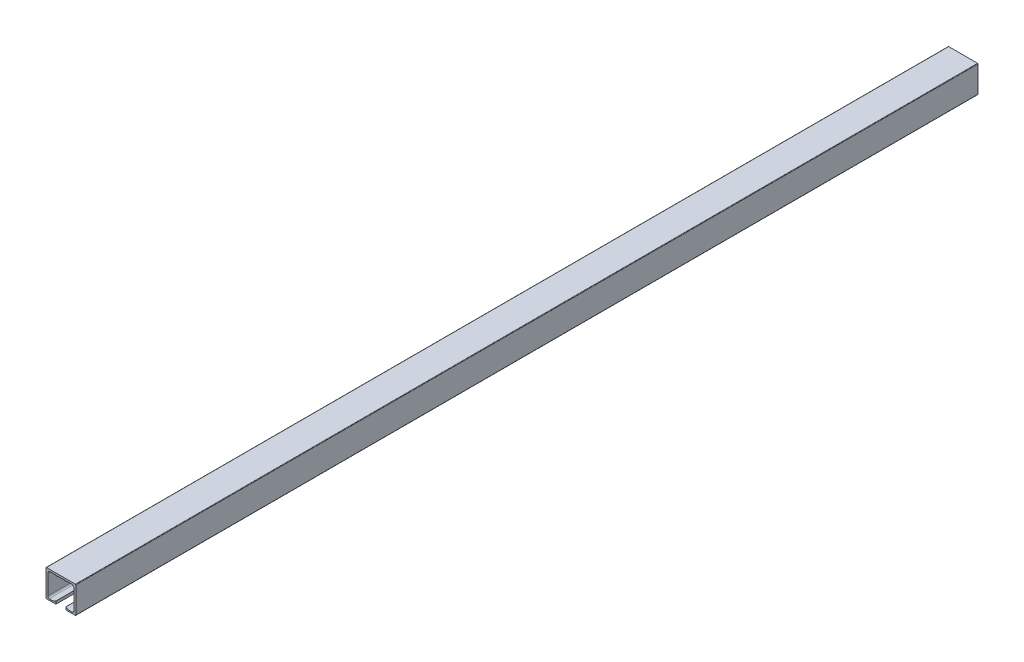
ISO-10303-21;
HEADER;
FILE_DESCRIPTION(('STEP AP214'),'2;1');
FILE_NAME('part.step','',(''),(''),'','','');
FILE_SCHEMA(('AUTOMOTIVE_DESIGN { 1 0 10303 214 1 1 1 1 }'));
ENDSEC;
DATA;
#1=APPLICATION_CONTEXT('core data for automotive mechanical design processes');
#2=APPLICATION_PROTOCOL_DEFINITION('international standard','automotive_design',2000,#1);
#3=PRODUCT_CONTEXT('',#1,'mechanical');
#4=PRODUCT('Part','Part','',(#3));
#5=PRODUCT_RELATED_PRODUCT_CATEGORY('part','',(#4));
#6=PRODUCT_DEFINITION_FORMATION('','',#4);
#7=PRODUCT_DEFINITION_CONTEXT('part definition',#1,'design');
#8=PRODUCT_DEFINITION('design','',#6,#7);
#9=PRODUCT_DEFINITION_SHAPE('','',#8);
#10=(LENGTH_UNIT() NAMED_UNIT(*) SI_UNIT(.MILLI.,.METRE.));
#11=(NAMED_UNIT(*) PLANE_ANGLE_UNIT() SI_UNIT($,.RADIAN.));
#12=(NAMED_UNIT(*) SI_UNIT($,.STERADIAN.) SOLID_ANGLE_UNIT());
#13=UNCERTAINTY_MEASURE_WITH_UNIT(LENGTH_MEASURE(1.E-05),#10,'distance_accuracy_value','');
#14=(GEOMETRIC_REPRESENTATION_CONTEXT(3) GLOBAL_UNCERTAINTY_ASSIGNED_CONTEXT((#13)) GLOBAL_UNIT_ASSIGNED_CONTEXT((#10,
#11,#12)) REPRESENTATION_CONTEXT('',''));
#15=CARTESIAN_POINT('',(0.,0.,0.));
#16=DIRECTION('',(0.,0.,1.));
#17=DIRECTION('',(1.,0.,0.));
#18=AXIS2_PLACEMENT_3D('',#15,#16,#17);
#19=CARTESIAN_POINT('',(10.5,-30.,1000.));
#20=DIRECTION('',(-1.,0.,0.));
#21=DIRECTION('',(0.,0.,1.));
#22=AXIS2_PLACEMENT_3D('',#19,#20,#21);
#23=PLANE('',#22);
#24=DIRECTION('',(0.,1.,0.));
#25=VECTOR('',#24,1.);
#26=CARTESIAN_POINT('',(10.5,-30.,0.));
#27=LINE('',#26,#25);
#28=CARTESIAN_POINT('',(10.5,-30.,0.));
#29=VERTEX_POINT('',#28);
#30=CARTESIAN_POINT('',(10.5,-27.,0.));
#31=VERTEX_POINT('',#30);
#32=EDGE_CURVE('E251',#29,#31,#27,.T.);
#33=ORIENTED_EDGE('',*,*,#32,.T.);
#34=DIRECTION('',(0.,0.,-1.));
#35=VECTOR('',#34,1.);
#36=CARTESIAN_POINT('',(10.5,-27.,1000.));
#37=LINE('',#36,#35);
#38=CARTESIAN_POINT('',(10.5,-27.,1000.));
#39=VERTEX_POINT('',#38);
#40=EDGE_CURVE('E11',#39,#31,#37,.T.);
#41=ORIENTED_EDGE('',*,*,#40,.F.);
#42=DIRECTION('',(0.,1.,0.));
#43=VECTOR('',#42,1.);
#44=CARTESIAN_POINT('',(10.5,-30.,1000.));
#45=LINE('',#44,#43);
#46=CARTESIAN_POINT('',(10.5,-30.,1000.));
#47=VERTEX_POINT('',#46);
#48=EDGE_CURVE('E305',#47,#39,#45,.T.);
#49=ORIENTED_EDGE('',*,*,#48,.F.);
#50=DIRECTION('',(0.,0.,-1.));
#51=VECTOR('',#50,1.);
#52=CARTESIAN_POINT('',(10.5,-30.,1000.));
#53=LINE('',#52,#51);
#54=EDGE_CURVE('E247',#47,#29,#53,.T.);
#55=ORIENTED_EDGE('',*,*,#54,.T.);
#56=EDGE_LOOP('',(#33,#41,#49,#55));
#57=FACE_BOUND('',#56,.T.);
#58=ADVANCED_FACE('F35',(#57),#23,.F.);
#59=CARTESIAN_POINT('',(4.94749132880816,-18.027421959274,1000.));
#60=DIRECTION('',(0.,0.,-1.));
#61=DIRECTION('',(-1.,0.,0.));
#62=AXIS2_PLACEMENT_3D('',#59,#60,#61);
#63=CYLINDRICAL_SURFACE('',#62,10.551659075263);
#64=CARTESIAN_POINT('',(4.94749132880816,-18.027421959274,0.));
#65=DIRECTION('',(0.,0.,-1.));
#66=DIRECTION('',(1.,0.,0.));
#67=AXIS2_PLACEMENT_3D('',#64,#65,#66);
#68=CIRCLE('',#67,10.551659075263);
#69=CARTESIAN_POINT('',(3.16147122656041,-28.4268277805176,0.));
#70=VERTEX_POINT('',#69);
#71=EDGE_CURVE('E254',#31,#70,#68,.T.);
#72=ORIENTED_EDGE('',*,*,#71,.T.);
#73=DIRECTION('',(0.,0.,-1.));
#74=VECTOR('',#73,1.);
#75=CARTESIAN_POINT('',(3.16147122656041,-28.4268277805176,1000.));
#76=LINE('',#75,#74);
#77=CARTESIAN_POINT('',(3.16147122656041,-28.4268277805176,1000.));
#78=VERTEX_POINT('',#77);
#79=EDGE_CURVE('E43',#78,#70,#76,.T.);
#80=ORIENTED_EDGE('',*,*,#79,.F.);
#81=CARTESIAN_POINT('',(4.94749132880816,-18.027421959274,1000.));
#82=DIRECTION('',(0.,0.,-1.));
#83=DIRECTION('',(1.,0.,0.));
#84=AXIS2_PLACEMENT_3D('',#81,#82,#83);
#85=CIRCLE('',#84,10.551659075263);
#86=EDGE_CURVE('E154',#39,#78,#85,.T.);
#87=ORIENTED_EDGE('',*,*,#86,.F.);
#88=ORIENTED_EDGE('',*,*,#40,.T.);
#89=EDGE_LOOP('',(#72,#80,#87,#88));
#90=FACE_BOUND('',#89,.T.);
#91=ADVANCED_FACE('F463',(#90),#63,.F.);
#92=CARTESIAN_POINT('',(3.5,-26.4556864183726,1000.));
#93=DIRECTION('',(0.,0.,-1.));
#94=DIRECTION('',(-1.,0.,0.));
#95=AXIS2_PLACEMENT_3D('',#92,#93,#94);
#96=CYLINDRICAL_SURFACE('',#95,2.00000000000141);
#97=CARTESIAN_POINT('',(3.5,-26.4556864183726,0.));
#98=DIRECTION('',(0.,0.,-1.));
#99=DIRECTION('',(1.,0.,0.));
#100=AXIS2_PLACEMENT_3D('',#97,#98,#99);
#101=CIRCLE('',#100,2.00000000000141);
#102=CARTESIAN_POINT('',(1.5,-26.4556864183726,0.));
#103=VERTEX_POINT('',#102);
#104=EDGE_CURVE('E256',#70,#103,#101,.T.);
#105=ORIENTED_EDGE('',*,*,#104,.T.);
#106=DIRECTION('',(0.,0.,-1.));
#107=VECTOR('',#106,1.);
#108=CARTESIAN_POINT('',(1.5,-26.4556864183726,1000.));
#109=LINE('',#108,#107);
#110=CARTESIAN_POINT('',(1.5,-26.4556864183726,1000.));
#111=VERTEX_POINT('',#110);
#112=EDGE_CURVE('E372',#111,#103,#109,.T.);
#113=ORIENTED_EDGE('',*,*,#112,.F.);
#114=CARTESIAN_POINT('',(3.5,-26.4556864183726,1000.));
#115=DIRECTION('',(0.,0.,-1.));
#116=DIRECTION('',(1.,0.,0.));
#117=AXIS2_PLACEMENT_3D('',#114,#115,#116);
#118=CIRCLE('',#117,2.00000000000141);
#119=EDGE_CURVE('E380',#78,#111,#118,.T.);
#120=ORIENTED_EDGE('',*,*,#119,.F.);
#121=ORIENTED_EDGE('',*,*,#79,.T.);
#122=EDGE_LOOP('',(#105,#113,#120,#121));
#123=FACE_BOUND('',#122,.T.);
#124=ADVANCED_FACE('F378',(#123),#96,.F.);
#125=CARTESIAN_POINT('',(1.5,-26.4556864183726,1000.));
#126=DIRECTION('',(-1.,0.,0.));
#127=DIRECTION('',(0.,0.,1.));
#128=AXIS2_PLACEMENT_3D('',#125,#126,#127);
#129=PLANE('',#128);
#130=DIRECTION('',(0.,1.,0.));
#131=VECTOR('',#130,1.);
#132=CARTESIAN_POINT('',(1.5,-26.4556864183726,0.));
#133=LINE('',#132,#131);
#134=CARTESIAN_POINT('',(1.5,-5.,0.));
#135=VERTEX_POINT('',#134);
#136=EDGE_CURVE('E258',#103,#135,#133,.T.);
#137=ORIENTED_EDGE('',*,*,#136,.T.);
#138=DIRECTION('',(0.,0.,-1.));
#139=VECTOR('',#138,1.);
#140=CARTESIAN_POINT('',(1.5,-5.,1000.));
#141=LINE('',#140,#139);
#142=CARTESIAN_POINT('',(1.5,-5.,1000.));
#143=VERTEX_POINT('',#142);
#144=EDGE_CURVE('E369',#143,#135,#141,.T.);
#145=ORIENTED_EDGE('',*,*,#144,.F.);
#146=DIRECTION('',(0.,1.,0.));
#147=VECTOR('',#146,1.);
#148=CARTESIAN_POINT('',(1.5,-26.4556864183726,1000.));
#149=LINE('',#148,#147);
#150=EDGE_CURVE('E398',#111,#143,#149,.T.);
#151=ORIENTED_EDGE('',*,*,#150,.F.);
#152=ORIENTED_EDGE('',*,*,#112,.T.);
#153=EDGE_LOOP('',(#137,#145,#151,#152));
#154=FACE_BOUND('',#153,.T.);
#155=ADVANCED_FACE('F389',(#154),#129,.F.);
#156=CARTESIAN_POINT('',(4.5,-5.,1000.));
#157=DIRECTION('',(0.,0.,-1.));
#158=DIRECTION('',(-1.,0.,0.));
#159=AXIS2_PLACEMENT_3D('',#156,#157,#158);
#160=CYLINDRICAL_SURFACE('',#159,3.);
#161=CARTESIAN_POINT('',(4.5,-5.,0.));
#162=DIRECTION('',(0.,0.,-1.));
#163=DIRECTION('',(1.,0.,0.));
#164=AXIS2_PLACEMENT_3D('',#161,#162,#163);
#165=CIRCLE('',#164,3.);
#166=CARTESIAN_POINT('',(4.5,-2.,0.));
#167=VERTEX_POINT('',#166);
#168=EDGE_CURVE('E260',#135,#167,#165,.T.);
#169=ORIENTED_EDGE('',*,*,#168,.T.);
#170=DIRECTION('',(0.,0.,-1.));
#171=VECTOR('',#170,1.);
#172=CARTESIAN_POINT('',(4.5,-2.,1000.));
#173=LINE('',#172,#171);
#174=CARTESIAN_POINT('',(4.5,-2.,1000.));
#175=VERTEX_POINT('',#174);
#176=EDGE_CURVE('E366',#175,#167,#173,.T.);
#177=ORIENTED_EDGE('',*,*,#176,.F.);
#178=CARTESIAN_POINT('',(4.5,-5.,1000.));
#179=DIRECTION('',(0.,0.,-1.));
#180=DIRECTION('',(1.,0.,0.));
#181=AXIS2_PLACEMENT_3D('',#178,#179,#180);
#182=CIRCLE('',#181,3.);
#183=EDGE_CURVE('E395',#143,#175,#182,.T.);
#184=ORIENTED_EDGE('',*,*,#183,.F.);
#185=ORIENTED_EDGE('',*,*,#144,.T.);
#186=EDGE_LOOP('',(#169,#177,#184,#185));
#187=FACE_BOUND('',#186,.T.);
#188=ADVANCED_FACE('F393',(#187),#160,.F.);
#189=CARTESIAN_POINT('',(4.5,-2.,1000.));
#190=DIRECTION('',(0.,1.,0.));
#191=DIRECTION('',(0.,0.,1.));
#192=AXIS2_PLACEMENT_3D('',#189,#190,#191);
#193=PLANE('',#192);
#194=DIRECTION('',(1.,0.,0.));
#195=VECTOR('',#194,1.);
#196=CARTESIAN_POINT('',(4.5,-2.,0.));
#197=LINE('',#196,#195);
#198=CARTESIAN_POINT('',(10.4377924169951,-2.,0.));
#199=VERTEX_POINT('',#198);
#200=EDGE_CURVE('E262',#167,#199,#197,.T.);
#201=ORIENTED_EDGE('',*,*,#200,.T.);
#202=DIRECTION('',(0.,0.,-1.));
#203=VECTOR('',#202,1.);
#204=CARTESIAN_POINT('',(10.4377924169951,-2.,1000.));
#205=LINE('',#204,#203);
#206=CARTESIAN_POINT('',(10.4377924169951,-2.,1000.));
#207=VERTEX_POINT('',#206);
#208=EDGE_CURVE('E363',#207,#199,#205,.T.);
#209=ORIENTED_EDGE('',*,*,#208,.F.);
#210=DIRECTION('',(1.,0.,0.));
#211=VECTOR('',#210,1.);
#212=CARTESIAN_POINT('',(4.5,-2.,1000.));
#213=LINE('',#212,#211);
#214=EDGE_CURVE('E397',#175,#207,#213,.T.);
#215=ORIENTED_EDGE('',*,*,#214,.F.);
#216=ORIENTED_EDGE('',*,*,#176,.T.);
#217=EDGE_LOOP('',(#201,#209,#215,#216));
#218=FACE_BOUND('',#217,.T.);
#219=ADVANCED_FACE('F476',(#218),#193,.F.);
#220=CARTESIAN_POINT('',(10.4377924169951,-2.,1000.));
#221=DIRECTION('',(0.877139625529131,0.480235439473823,0.));
#222=DIRECTION('',(-0.480235439473823,0.877139625529131,0.));
#223=AXIS2_PLACEMENT_3D('',#220,#221,#222);
#224=PLANE('',#223);
#225=DIRECTION('',(0.480235439473823,-0.877139625529131,0.));
#226=VECTOR('',#225,1.);
#227=CARTESIAN_POINT('',(10.4377924169951,-2.,0.));
#228=LINE('',#227,#226);
#229=CARTESIAN_POINT('',(10.8245720748942,-2.70644466527424,0.));
#230=VERTEX_POINT('',#229);
#231=EDGE_CURVE('E264',#199,#230,#228,.T.);
#232=ORIENTED_EDGE('',*,*,#231,.T.);
#233=DIRECTION('',(0.,0.,-1.));
#234=VECTOR('',#233,1.);
#235=CARTESIAN_POINT('',(10.8245720748942,-2.70644466527424,1000.));
#236=LINE('',#235,#234);
#237=CARTESIAN_POINT('',(10.8245720748942,-2.70644466527424,1000.));
#238=VERTEX_POINT('',#237);
#239=EDGE_CURVE('E360',#238,#230,#236,.T.);
#240=ORIENTED_EDGE('',*,*,#239,.F.);
#241=DIRECTION('',(0.480235439473823,-0.877139625529131,0.));
#242=VECTOR('',#241,1.);
#243=CARTESIAN_POINT('',(10.4377924169951,-2.,1000.));
#244=LINE('',#243,#242);
#245=EDGE_CURVE('E400',#207,#238,#244,.T.);
#246=ORIENTED_EDGE('',*,*,#245,.F.);
#247=ORIENTED_EDGE('',*,*,#208,.T.);
#248=EDGE_LOOP('',(#232,#240,#246,#247));
#249=FACE_BOUND('',#248,.T.);
#250=ADVANCED_FACE('F479',(#249),#224,.F.);
#251=CARTESIAN_POINT('',(11.,-2.61039757737944,1000.));
#252=DIRECTION('',(0.,0.,-1.));
#253=DIRECTION('',(-1.,0.,0.));
#254=AXIS2_PLACEMENT_3D('',#251,#252,#253);
#255=CYLINDRICAL_SURFACE('',#254,0.199999999999999);
#256=CARTESIAN_POINT('',(11.,-2.61039757737944,0.));
#257=DIRECTION('',(0.,0.,1.));
#258=DIRECTION('',(1.,0.,0.));
#259=AXIS2_PLACEMENT_3D('',#256,#257,#258);
#260=CIRCLE('',#259,0.199999999999999);
#261=CARTESIAN_POINT('',(11.1754279251058,-2.70644466527424,0.));
#262=VERTEX_POINT('',#261);
#263=EDGE_CURVE('E266',#230,#262,#260,.T.);
#264=ORIENTED_EDGE('',*,*,#263,.T.);
#265=DIRECTION('',(0.,0.,-1.));
#266=VECTOR('',#265,1.);
#267=CARTESIAN_POINT('',(11.1754279251058,-2.70644466527424,1000.));
#268=LINE('',#267,#266);
#269=CARTESIAN_POINT('',(11.1754279251058,-2.70644466527424,1000.));
#270=VERTEX_POINT('',#269);
#271=EDGE_CURVE('E357',#270,#262,#268,.T.);
#272=ORIENTED_EDGE('',*,*,#271,.F.);
#273=CARTESIAN_POINT('',(11.,-2.61039757737944,1000.));
#274=DIRECTION('',(0.,0.,1.));
#275=DIRECTION('',(1.,0.,0.));
#276=AXIS2_PLACEMENT_3D('',#273,#274,#275);
#277=CIRCLE('',#276,0.199999999999999);
#278=EDGE_CURVE('E406',#238,#270,#277,.T.);
#279=ORIENTED_EDGE('',*,*,#278,.F.);
#280=ORIENTED_EDGE('',*,*,#239,.T.);
#281=EDGE_LOOP('',(#264,#272,#279,#280));
#282=FACE_BOUND('',#281,.T.);
#283=ADVANCED_FACE('F483',(#282),#255,.T.);
#284=CARTESIAN_POINT('',(11.5622075830051,-2.,1000.));
#285=DIRECTION('',(-0.877139625529012,0.48023543947404,0.));
#286=DIRECTION('',(-0.48023543947404,-0.877139625529012,0.));
#287=AXIS2_PLACEMENT_3D('',#284,#285,#286);
#288=PLANE('',#287);
#289=DIRECTION('',(0.48023543947404,0.877139625529012,0.));
#290=VECTOR('',#289,1.);
#291=CARTESIAN_POINT('',(11.5622075830051,-2.,0.));
#292=LINE('',#291,#290);
#293=CARTESIAN_POINT('',(11.5622075830051,-2.,0.));
#294=VERTEX_POINT('',#293);
#295=EDGE_CURVE('E268',#262,#294,#292,.T.);
#296=ORIENTED_EDGE('',*,*,#295,.T.);
#297=DIRECTION('',(0.,0.,-1.));
#298=VECTOR('',#297,1.);
#299=CARTESIAN_POINT('',(11.5622075830051,-2.,1000.));
#300=LINE('',#299,#298);
#301=CARTESIAN_POINT('',(11.5622075830051,-2.,1000.));
#302=VERTEX_POINT('',#301);
#303=EDGE_CURVE('E354',#302,#294,#300,.T.);
#304=ORIENTED_EDGE('',*,*,#303,.F.);
#305=DIRECTION('',(0.48023543947404,0.877139625529012,0.));
#306=VECTOR('',#305,1.);
#307=CARTESIAN_POINT('',(11.5622075830051,-2.,1000.));
#308=LINE('',#307,#306);
#309=EDGE_CURVE('E408',#270,#302,#308,.T.);
#310=ORIENTED_EDGE('',*,*,#309,.F.);
#311=ORIENTED_EDGE('',*,*,#271,.T.);
#312=EDGE_LOOP('',(#296,#304,#310,#311));
#313=FACE_BOUND('',#312,.T.);
#314=ADVANCED_FACE('F487',(#313),#288,.F.);
#315=CARTESIAN_POINT('',(11.5622075830051,-2.,1000.));
#316=DIRECTION('',(0.,1.,0.));
#317=DIRECTION('',(0.,0.,1.));
#318=AXIS2_PLACEMENT_3D('',#315,#316,#317);
#319=PLANE('',#318);
#320=DIRECTION('',(1.,0.,0.));
#321=VECTOR('',#320,1.);
#322=CARTESIAN_POINT('',(11.5622075830051,-2.,0.));
#323=LINE('',#322,#321);
#324=CARTESIAN_POINT('',(20.4377924169951,-2.,0.));
#325=VERTEX_POINT('',#324);
#326=EDGE_CURVE('E270',#294,#325,#323,.T.);
#327=ORIENTED_EDGE('',*,*,#326,.T.);
#328=DIRECTION('',(0.,0.,-1.));
#329=VECTOR('',#328,1.);
#330=CARTESIAN_POINT('',(20.4377924169951,-2.,1000.));
#331=LINE('',#330,#329);
#332=CARTESIAN_POINT('',(20.4377924169951,-2.,1000.));
#333=VERTEX_POINT('',#332);
#334=EDGE_CURVE('E351',#333,#325,#331,.T.);
#335=ORIENTED_EDGE('',*,*,#334,.F.);
#336=DIRECTION('',(1.,0.,0.));
#337=VECTOR('',#336,1.);
#338=CARTESIAN_POINT('',(11.5622075830051,-2.,1000.));
#339=LINE('',#338,#337);
#340=EDGE_CURVE('E410',#302,#333,#339,.T.);
#341=ORIENTED_EDGE('',*,*,#340,.F.);
#342=ORIENTED_EDGE('',*,*,#303,.T.);
#343=EDGE_LOOP('',(#327,#335,#341,#342));
#344=FACE_BOUND('',#343,.T.);
#345=ADVANCED_FACE('F491',(#344),#319,.F.);
#346=CARTESIAN_POINT('',(20.4377924169951,-2.,1000.));
#347=DIRECTION('',(0.877139625529133,0.48023543947382,0.));
#348=DIRECTION('',(-0.48023543947382,0.877139625529132,0.));
#349=AXIS2_PLACEMENT_3D('',#346,#347,#348);
#350=PLANE('',#349);
#351=DIRECTION('',(0.48023543947382,-0.877139625529132,0.));
#352=VECTOR('',#351,1.);
#353=CARTESIAN_POINT('',(20.4377924169951,-2.,0.));
#354=LINE('',#353,#352);
#355=CARTESIAN_POINT('',(20.8245720748942,-2.70644466527422,0.));
#356=VERTEX_POINT('',#355);
#357=EDGE_CURVE('E272',#325,#356,#354,.T.);
#358=ORIENTED_EDGE('',*,*,#357,.T.);
#359=DIRECTION('',(0.,0.,-1.));
#360=VECTOR('',#359,1.);
#361=CARTESIAN_POINT('',(20.8245720748942,-2.70644466527422,1000.));
#362=LINE('',#361,#360);
#363=CARTESIAN_POINT('',(20.8245720748942,-2.70644466527422,1000.));
#364=VERTEX_POINT('',#363);
#365=EDGE_CURVE('E348',#364,#356,#362,.T.);
#366=ORIENTED_EDGE('',*,*,#365,.F.);
#367=DIRECTION('',(0.48023543947382,-0.877139625529132,0.));
#368=VECTOR('',#367,1.);
#369=CARTESIAN_POINT('',(20.4377924169951,-2.,1000.));
#370=LINE('',#369,#368);
#371=EDGE_CURVE('E412',#333,#364,#370,.T.);
#372=ORIENTED_EDGE('',*,*,#371,.F.);
#373=ORIENTED_EDGE('',*,*,#334,.T.);
#374=EDGE_LOOP('',(#358,#366,#372,#373));
#375=FACE_BOUND('',#374,.T.);
#376=ADVANCED_FACE('F495',(#375),#350,.F.);
#377=CARTESIAN_POINT('',(21.,-2.61039757737944,1000.));
#378=DIRECTION('',(0.,0.,-1.));
#379=DIRECTION('',(-1.,0.,0.));
#380=AXIS2_PLACEMENT_3D('',#377,#378,#379);
#381=CYLINDRICAL_SURFACE('',#380,0.2);
#382=CARTESIAN_POINT('',(21.,-2.61039757737944,0.));
#383=DIRECTION('',(0.,0.,1.));
#384=DIRECTION('',(1.,0.,0.));
#385=AXIS2_PLACEMENT_3D('',#382,#383,#384);
#386=CIRCLE('',#385,0.2);
#387=CARTESIAN_POINT('',(21.1754279251058,-2.70644466527422,0.));
#388=VERTEX_POINT('',#387);
#389=EDGE_CURVE('E274',#356,#388,#386,.T.);
#390=ORIENTED_EDGE('',*,*,#389,.T.);
#391=DIRECTION('',(0.,0.,-1.));
#392=VECTOR('',#391,1.);
#393=CARTESIAN_POINT('',(21.1754279251058,-2.70644466527422,1000.));
#394=LINE('',#393,#392);
#395=CARTESIAN_POINT('',(21.1754279251058,-2.70644466527422,1000.));
#396=VERTEX_POINT('',#395);
#397=EDGE_CURVE('E345',#396,#388,#394,.T.);
#398=ORIENTED_EDGE('',*,*,#397,.F.);
#399=CARTESIAN_POINT('',(21.,-2.61039757737944,1000.));
#400=DIRECTION('',(0.,0.,1.));
#401=DIRECTION('',(1.,0.,0.));
#402=AXIS2_PLACEMENT_3D('',#399,#400,#401);
#403=CIRCLE('',#402,0.2);
#404=EDGE_CURVE('E414',#364,#396,#403,.T.);
#405=ORIENTED_EDGE('',*,*,#404,.F.);
#406=ORIENTED_EDGE('',*,*,#365,.T.);
#407=EDGE_LOOP('',(#390,#398,#405,#406));
#408=FACE_BOUND('',#407,.T.);
#409=ADVANCED_FACE('F499',(#408),#381,.T.);
#410=CARTESIAN_POINT('',(21.5622075830051,-2.,1000.));
#411=DIRECTION('',(-0.877139625529013,0.480235439474039,0.));
#412=DIRECTION('',(-0.480235439474039,-0.877139625529013,0.));
#413=AXIS2_PLACEMENT_3D('',#410,#411,#412);
#414=PLANE('',#413);
#415=DIRECTION('',(0.480235439474039,0.877139625529013,0.));
#416=VECTOR('',#415,1.);
#417=CARTESIAN_POINT('',(21.5622075830051,-2.,0.));
#418=LINE('',#417,#416);
#419=CARTESIAN_POINT('',(21.5622075830051,-2.,0.));
#420=VERTEX_POINT('',#419);
#421=EDGE_CURVE('E276',#388,#420,#418,.T.);
#422=ORIENTED_EDGE('',*,*,#421,.T.);
#423=DIRECTION('',(0.,0.,-1.));
#424=VECTOR('',#423,1.);
#425=CARTESIAN_POINT('',(21.5622075830051,-2.,1000.));
#426=LINE('',#425,#424);
#427=CARTESIAN_POINT('',(21.5622075830051,-2.,1000.));
#428=VERTEX_POINT('',#427);
#429=EDGE_CURVE('E342',#428,#420,#426,.T.);
#430=ORIENTED_EDGE('',*,*,#429,.F.);
#431=DIRECTION('',(0.480235439474039,0.877139625529013,0.));
#432=VECTOR('',#431,1.);
#433=CARTESIAN_POINT('',(21.5622075830051,-2.,1000.));
#434=LINE('',#433,#432);
#435=EDGE_CURVE('E416',#396,#428,#434,.T.);
#436=ORIENTED_EDGE('',*,*,#435,.F.);
#437=ORIENTED_EDGE('',*,*,#397,.T.);
#438=EDGE_LOOP('',(#422,#430,#436,#437));
#439=FACE_BOUND('',#438,.T.);
#440=ADVANCED_FACE('F503',(#439),#414,.F.);
#441=CARTESIAN_POINT('',(21.5622075830051,-2.,1000.));
#442=DIRECTION('',(0.,1.,0.));
#443=DIRECTION('',(0.,0.,1.));
#444=AXIS2_PLACEMENT_3D('',#441,#442,#443);
#445=PLANE('',#444);
#446=DIRECTION('',(1.,0.,0.));
#447=VECTOR('',#446,1.);
#448=CARTESIAN_POINT('',(21.5622075830051,-2.,0.));
#449=LINE('',#448,#447);
#450=CARTESIAN_POINT('',(27.5,-2.,0.));
#451=VERTEX_POINT('',#450);
#452=EDGE_CURVE('E278',#420,#451,#449,.T.);
#453=ORIENTED_EDGE('',*,*,#452,.T.);
#454=DIRECTION('',(0.,0.,-1.));
#455=VECTOR('',#454,1.);
#456=CARTESIAN_POINT('',(27.5,-2.,1000.));
#457=LINE('',#456,#455);
#458=CARTESIAN_POINT('',(27.5,-2.,1000.));
#459=VERTEX_POINT('',#458);
#460=EDGE_CURVE('E339',#459,#451,#457,.T.);
#461=ORIENTED_EDGE('',*,*,#460,.F.);
#462=DIRECTION('',(1.,0.,0.));
#463=VECTOR('',#462,1.);
#464=CARTESIAN_POINT('',(21.5622075830051,-2.,1000.));
#465=LINE('',#464,#463);
#466=EDGE_CURVE('E418',#428,#459,#465,.T.);
#467=ORIENTED_EDGE('',*,*,#466,.F.);
#468=ORIENTED_EDGE('',*,*,#429,.T.);
#469=EDGE_LOOP('',(#453,#461,#467,#468));
#470=FACE_BOUND('',#469,.T.);
#471=ADVANCED_FACE('F507',(#470),#445,.F.);
#472=CARTESIAN_POINT('',(27.5,-5.,1000.));
#473=DIRECTION('',(0.,0.,-1.));
#474=DIRECTION('',(-1.,0.,0.));
#475=AXIS2_PLACEMENT_3D('',#472,#473,#474);
#476=CYLINDRICAL_SURFACE('',#475,3.);
#477=CARTESIAN_POINT('',(27.5,-5.,0.));
#478=DIRECTION('',(0.,0.,-1.));
#479=DIRECTION('',(1.,0.,0.));
#480=AXIS2_PLACEMENT_3D('',#477,#478,#479);
#481=CIRCLE('',#480,3.);
#482=CARTESIAN_POINT('',(30.5,-5.,0.));
#483=VERTEX_POINT('',#482);
#484=EDGE_CURVE('E280',#451,#483,#481,.T.);
#485=ORIENTED_EDGE('',*,*,#484,.T.);
#486=DIRECTION('',(0.,0.,-1.));
#487=VECTOR('',#486,1.);
#488=CARTESIAN_POINT('',(30.5,-5.,1000.));
#489=LINE('',#488,#487);
#490=CARTESIAN_POINT('',(30.5,-5.,1000.));
#491=VERTEX_POINT('',#490);
#492=EDGE_CURVE('E336',#491,#483,#489,.T.);
#493=ORIENTED_EDGE('',*,*,#492,.F.);
#494=CARTESIAN_POINT('',(27.5,-5.,1000.));
#495=DIRECTION('',(0.,0.,-1.));
#496=DIRECTION('',(1.,0.,0.));
#497=AXIS2_PLACEMENT_3D('',#494,#495,#496);
#498=CIRCLE('',#497,3.);
#499=EDGE_CURVE('E420',#459,#491,#498,.T.);
#500=ORIENTED_EDGE('',*,*,#499,.F.);
#501=ORIENTED_EDGE('',*,*,#460,.T.);
#502=EDGE_LOOP('',(#485,#493,#500,#501));
#503=FACE_BOUND('',#502,.T.);
#504=ADVANCED_FACE('F511',(#503),#476,.F.);
#505=CARTESIAN_POINT('',(30.5,-5.,1000.));
#506=DIRECTION('',(1.,0.,0.));
#507=DIRECTION('',(0.,0.,-1.));
#508=AXIS2_PLACEMENT_3D('',#505,#506,#507);
#509=PLANE('',#508);
#510=DIRECTION('',(0.,-1.,0.));
#511=VECTOR('',#510,1.);
#512=CARTESIAN_POINT('',(30.5,-5.,0.));
#513=LINE('',#512,#511);
#514=CARTESIAN_POINT('',(30.5000000000014,-26.4556864183726,0.));
#515=VERTEX_POINT('',#514);
#516=EDGE_CURVE('E282',#483,#515,#513,.T.);
#517=ORIENTED_EDGE('',*,*,#516,.T.);
#518=DIRECTION('',(0.,0.,-1.));
#519=VECTOR('',#518,1.);
#520=CARTESIAN_POINT('',(30.5000000000014,-26.4556864183726,1000.));
#521=LINE('',#520,#519);
#522=CARTESIAN_POINT('',(30.5000000000014,-26.4556864183726,1000.));
#523=VERTEX_POINT('',#522);
#524=EDGE_CURVE('E333',#523,#515,#521,.T.);
#525=ORIENTED_EDGE('',*,*,#524,.F.);
#526=DIRECTION('',(0.,-1.,0.));
#527=VECTOR('',#526,1.);
#528=CARTESIAN_POINT('',(30.5,-5.,1000.));
#529=LINE('',#528,#527);
#530=EDGE_CURVE('E422',#491,#523,#529,.T.);
#531=ORIENTED_EDGE('',*,*,#530,.F.);
#532=ORIENTED_EDGE('',*,*,#492,.T.);
#533=EDGE_LOOP('',(#517,#525,#531,#532));
#534=FACE_BOUND('',#533,.T.);
#535=ADVANCED_FACE('F515',(#534),#509,.F.);
#536=CARTESIAN_POINT('',(28.5,-26.4556864183726,1000.));
#537=DIRECTION('',(0.,0.,-1.));
#538=DIRECTION('',(-1.,0.,0.));
#539=AXIS2_PLACEMENT_3D('',#536,#537,#538);
#540=CYLINDRICAL_SURFACE('',#539,2.00000000000141);
#541=CARTESIAN_POINT('',(28.5,-26.4556864183726,0.));
#542=DIRECTION('',(0.,0.,-1.));
#543=DIRECTION('',(1.,0.,0.));
#544=AXIS2_PLACEMENT_3D('',#541,#542,#543);
#545=CIRCLE('',#544,2.00000000000141);
#546=CARTESIAN_POINT('',(28.8385287734398,-28.426827780519,0.));
#547=VERTEX_POINT('',#546);
#548=EDGE_CURVE('E284',#515,#547,#545,.T.);
#549=ORIENTED_EDGE('',*,*,#548,.T.);
#550=DIRECTION('',(0.,0.,-1.));
#551=VECTOR('',#550,1.);
#552=CARTESIAN_POINT('',(28.8385287734398,-28.426827780519,1000.));
#553=LINE('',#552,#551);
#554=CARTESIAN_POINT('',(28.8385287734398,-28.426827780519,1000.));
#555=VERTEX_POINT('',#554);
#556=EDGE_CURVE('E330',#555,#547,#553,.T.);
#557=ORIENTED_EDGE('',*,*,#556,.F.);
#558=CARTESIAN_POINT('',(28.5,-26.4556864183726,1000.));
#559=DIRECTION('',(0.,0.,-1.));
#560=DIRECTION('',(1.,0.,0.));
#561=AXIS2_PLACEMENT_3D('',#558,#559,#560);
#562=CIRCLE('',#561,2.00000000000141);
#563=EDGE_CURVE('E424',#523,#555,#562,.T.);
#564=ORIENTED_EDGE('',*,*,#563,.F.);
#565=ORIENTED_EDGE('',*,*,#524,.T.);
#566=EDGE_LOOP('',(#549,#557,#564,#565));
#567=FACE_BOUND('',#566,.T.);
#568=ADVANCED_FACE('F519',(#567),#540,.F.);
#569=CARTESIAN_POINT('',(27.0525086711918,-18.027421959274,1000.));
#570=DIRECTION('',(0.,0.,-1.));
#571=DIRECTION('',(-1.,0.,0.));
#572=AXIS2_PLACEMENT_3D('',#569,#570,#571);
#573=CYLINDRICAL_SURFACE('',#572,10.551659075263);
#574=CARTESIAN_POINT('',(27.0525086711918,-18.027421959274,0.));
#575=DIRECTION('',(0.,0.,-1.));
#576=DIRECTION('',(1.,0.,0.));
#577=AXIS2_PLACEMENT_3D('',#574,#575,#576);
#578=CIRCLE('',#577,10.551659075263);
#579=CARTESIAN_POINT('',(21.5,-27.,0.));
#580=VERTEX_POINT('',#579);
#581=EDGE_CURVE('E286',#547,#580,#578,.T.);
#582=ORIENTED_EDGE('',*,*,#581,.T.);
#583=DIRECTION('',(0.,0.,-1.));
#584=VECTOR('',#583,1.);
#585=CARTESIAN_POINT('',(21.5,-27.,1000.));
#586=LINE('',#585,#584);
#587=CARTESIAN_POINT('',(21.5,-27.,1000.));
#588=VERTEX_POINT('',#587);
#589=EDGE_CURVE('E327',#588,#580,#586,.T.);
#590=ORIENTED_EDGE('',*,*,#589,.F.);
#591=CARTESIAN_POINT('',(27.0525086711918,-18.027421959274,1000.));
#592=DIRECTION('',(0.,0.,-1.));
#593=DIRECTION('',(1.,0.,0.));
#594=AXIS2_PLACEMENT_3D('',#591,#592,#593);
#595=CIRCLE('',#594,10.551659075263);
#596=EDGE_CURVE('E426',#555,#588,#595,.T.);
#597=ORIENTED_EDGE('',*,*,#596,.F.);
#598=ORIENTED_EDGE('',*,*,#556,.T.);
#599=EDGE_LOOP('',(#582,#590,#597,#598));
#600=FACE_BOUND('',#599,.T.);
#601=ADVANCED_FACE('F523',(#600),#573,.F.);
#602=CARTESIAN_POINT('',(21.5,-30.,1000.));
#603=DIRECTION('',(1.,0.,0.));
#604=DIRECTION('',(0.,0.,-1.));
#605=AXIS2_PLACEMENT_3D('',#602,#603,#604);
#606=PLANE('',#605);
#607=DIRECTION('',(0.,-1.,0.));
#608=VECTOR('',#607,1.);
#609=CARTESIAN_POINT('',(21.5,-30.,0.));
#610=LINE('',#609,#608);
#611=CARTESIAN_POINT('',(21.5,-30.,0.));
#612=VERTEX_POINT('',#611);
#613=EDGE_CURVE('E288',#580,#612,#610,.T.);
#614=ORIENTED_EDGE('',*,*,#613,.T.);
#615=DIRECTION('',(0.,0.,-1.));
#616=VECTOR('',#615,1.);
#617=CARTESIAN_POINT('',(21.5,-30.,1000.));
#618=LINE('',#617,#616);
#619=CARTESIAN_POINT('',(21.5,-30.,1000.));
#620=VERTEX_POINT('',#619);
#621=EDGE_CURVE('E324',#620,#612,#618,.T.);
#622=ORIENTED_EDGE('',*,*,#621,.F.);
#623=DIRECTION('',(0.,-1.,0.));
#624=VECTOR('',#623,1.);
#625=CARTESIAN_POINT('',(21.5,-30.,1000.));
#626=LINE('',#625,#624);
#627=EDGE_CURVE('E428',#588,#620,#626,.T.);
#628=ORIENTED_EDGE('',*,*,#627,.F.);
#629=ORIENTED_EDGE('',*,*,#589,.T.);
#630=EDGE_LOOP('',(#614,#622,#628,#629));
#631=FACE_BOUND('',#630,.T.);
#632=ADVANCED_FACE('F527',(#631),#606,.F.);
#633=CARTESIAN_POINT('',(32.,-29.9999999999999,1000.));
#634=DIRECTION('',(0.,1.,0.));
#635=DIRECTION('',(-1.,0.,0.));
#636=AXIS2_PLACEMENT_3D('',#633,#634,#635);
#637=PLANE('',#636);
#638=DIRECTION('',(1.,0.,0.));
#639=VECTOR('',#638,1.);
#640=CARTESIAN_POINT('',(32.,-29.9999999999999,0.));
#641=LINE('',#640,#639);
#642=CARTESIAN_POINT('',(32.,-29.9999999999999,0.));
#643=VERTEX_POINT('',#642);
#644=EDGE_CURVE('E290',#612,#643,#641,.T.);
#645=ORIENTED_EDGE('',*,*,#644,.T.);
#646=DIRECTION('',(0.,0.,-1.));
#647=VECTOR('',#646,1.);
#648=CARTESIAN_POINT('',(32.,-29.9999999999999,1000.));
#649=LINE('',#648,#647);
#650=CARTESIAN_POINT('',(32.,-29.9999999999999,1000.));
#651=VERTEX_POINT('',#650);
#652=EDGE_CURVE('E321',#651,#643,#649,.T.);
#653=ORIENTED_EDGE('',*,*,#652,.F.);
#654=DIRECTION('',(1.,0.,0.));
#655=VECTOR('',#654,1.);
#656=CARTESIAN_POINT('',(32.,-29.9999999999999,1000.));
#657=LINE('',#656,#655);
#658=EDGE_CURVE('E430',#620,#651,#657,.T.);
#659=ORIENTED_EDGE('',*,*,#658,.F.);
#660=ORIENTED_EDGE('',*,*,#621,.T.);
#661=EDGE_LOOP('',(#645,#653,#659,#660));
#662=FACE_BOUND('',#661,.T.);
#663=ADVANCED_FACE('F531',(#662),#637,.F.);
#664=CARTESIAN_POINT('',(32.,-29.4999999999999,1000.));
#665=DIRECTION('',(0.,0.,-1.));
#666=DIRECTION('',(-1.,0.,0.));
#667=AXIS2_PLACEMENT_3D('',#664,#665,#666);
#668=CYLINDRICAL_SURFACE('',#667,0.5);
#669=CARTESIAN_POINT('',(32.,-29.4999999999999,0.));
#670=DIRECTION('',(0.,0.,1.));
#671=DIRECTION('',(1.,0.,0.));
#672=AXIS2_PLACEMENT_3D('',#669,#670,#671);
#673=CIRCLE('',#672,0.5);
#674=CARTESIAN_POINT('',(32.5,-29.4999999999999,0.));
#675=VERTEX_POINT('',#674);
#676=EDGE_CURVE('E292',#643,#675,#673,.T.);
#677=ORIENTED_EDGE('',*,*,#676,.T.);
#678=DIRECTION('',(0.,0.,-1.));
#679=VECTOR('',#678,1.);
#680=CARTESIAN_POINT('',(32.5,-29.4999999999999,1000.));
#681=LINE('',#680,#679);
#682=CARTESIAN_POINT('',(32.5,-29.4999999999999,1000.));
#683=VERTEX_POINT('',#682);
#684=EDGE_CURVE('E318',#683,#675,#681,.T.);
#685=ORIENTED_EDGE('',*,*,#684,.F.);
#686=CARTESIAN_POINT('',(32.,-29.4999999999999,1000.));
#687=DIRECTION('',(0.,0.,1.));
#688=DIRECTION('',(1.,0.,0.));
#689=AXIS2_PLACEMENT_3D('',#686,#687,#688);
#690=CIRCLE('',#689,0.5);
#691=EDGE_CURVE('E432',#651,#683,#690,.T.);
#692=ORIENTED_EDGE('',*,*,#691,.F.);
#693=ORIENTED_EDGE('',*,*,#652,.T.);
#694=EDGE_LOOP('',(#677,#685,#692,#693));
#695=FACE_BOUND('',#694,.T.);
#696=ADVANCED_FACE('F535',(#695),#668,.T.);
#697=CARTESIAN_POINT('',(32.5,-0.5,1000.));
#698=DIRECTION('',(-1.,0.,0.));
#699=DIRECTION('',(0.,0.,1.));
#700=AXIS2_PLACEMENT_3D('',#697,#698,#699);
#701=PLANE('',#700);
#702=DIRECTION('',(0.,1.,0.));
#703=VECTOR('',#702,1.);
#704=CARTESIAN_POINT('',(32.5,-0.5,0.));
#705=LINE('',#704,#703);
#706=CARTESIAN_POINT('',(32.5,-0.5,0.));
#707=VERTEX_POINT('',#706);
#708=EDGE_CURVE('E294',#675,#707,#705,.T.);
#709=ORIENTED_EDGE('',*,*,#708,.T.);
#710=DIRECTION('',(0.,0.,-1.));
#711=VECTOR('',#710,1.);
#712=CARTESIAN_POINT('',(32.5,-0.5,1000.));
#713=LINE('',#712,#711);
#714=CARTESIAN_POINT('',(32.5,-0.5,1000.));
#715=VERTEX_POINT('',#714);
#716=EDGE_CURVE('E315',#715,#707,#713,.T.);
#717=ORIENTED_EDGE('',*,*,#716,.F.);
#718=DIRECTION('',(0.,1.,0.));
#719=VECTOR('',#718,1.);
#720=CARTESIAN_POINT('',(32.5,-0.5,1000.));
#721=LINE('',#720,#719);
#722=EDGE_CURVE('E434',#683,#715,#721,.T.);
#723=ORIENTED_EDGE('',*,*,#722,.F.);
#724=ORIENTED_EDGE('',*,*,#684,.T.);
#725=EDGE_LOOP('',(#709,#717,#723,#724));
#726=FACE_BOUND('',#725,.T.);
#727=ADVANCED_FACE('F539',(#726),#701,.F.);
#728=CARTESIAN_POINT('',(32.,-0.5,1000.));
#729=DIRECTION('',(0.,0.,-1.));
#730=DIRECTION('',(-1.,0.,0.));
#731=AXIS2_PLACEMENT_3D('',#728,#729,#730);
#732=CYLINDRICAL_SURFACE('',#731,0.5);
#733=CARTESIAN_POINT('',(32.,-0.5,0.));
#734=DIRECTION('',(0.,0.,1.));
#735=DIRECTION('',(1.,0.,0.));
#736=AXIS2_PLACEMENT_3D('',#733,#734,#735);
#737=CIRCLE('',#736,0.5);
#738=CARTESIAN_POINT('',(32.,0.,0.));
#739=VERTEX_POINT('',#738);
#740=EDGE_CURVE('E296',#707,#739,#737,.T.);
#741=ORIENTED_EDGE('',*,*,#740,.T.);
#742=DIRECTION('',(0.,0.,-1.));
#743=VECTOR('',#742,1.);
#744=CARTESIAN_POINT('',(32.,0.,1000.));
#745=LINE('',#744,#743);
#746=CARTESIAN_POINT('',(32.,0.,1000.));
#747=VERTEX_POINT('',#746);
#748=EDGE_CURVE('E312',#747,#739,#745,.T.);
#749=ORIENTED_EDGE('',*,*,#748,.F.);
#750=CARTESIAN_POINT('',(32.,-0.5,1000.));
#751=DIRECTION('',(0.,0.,1.));
#752=DIRECTION('',(1.,0.,0.));
#753=AXIS2_PLACEMENT_3D('',#750,#751,#752);
#754=CIRCLE('',#753,0.5);
#755=EDGE_CURVE('E436',#715,#747,#754,.T.);
#756=ORIENTED_EDGE('',*,*,#755,.F.);
#757=ORIENTED_EDGE('',*,*,#716,.T.);
#758=EDGE_LOOP('',(#741,#749,#756,#757));
#759=FACE_BOUND('',#758,.T.);
#760=ADVANCED_FACE('F543',(#759),#732,.T.);
#761=CARTESIAN_POINT('',(0.,0.,1000.));
#762=DIRECTION('',(0.,-1.,0.));
#763=DIRECTION('',(0.,0.,-1.));
#764=AXIS2_PLACEMENT_3D('',#761,#762,#763);
#765=PLANE('',#764);
#766=DIRECTION('',(-1.,0.,0.));
#767=VECTOR('',#766,1.);
#768=CARTESIAN_POINT('',(0.,0.,0.));
#769=LINE('',#768,#767);
#770=CARTESIAN_POINT('',(0.,0.,0.));
#771=VERTEX_POINT('',#770);
#772=EDGE_CURVE('E298',#739,#771,#769,.T.);
#773=ORIENTED_EDGE('',*,*,#772,.T.);
#774=DIRECTION('',(0.,0.,-1.));
#775=VECTOR('',#774,1.);
#776=CARTESIAN_POINT('',(0.,0.,1000.));
#777=LINE('',#776,#775);
#778=CARTESIAN_POINT('',(0.,0.,1000.));
#779=VERTEX_POINT('',#778);
#780=EDGE_CURVE('E309',#779,#771,#777,.T.);
#781=ORIENTED_EDGE('',*,*,#780,.F.);
#782=DIRECTION('',(-1.,0.,0.));
#783=VECTOR('',#782,1.);
#784=CARTESIAN_POINT('',(0.,0.,1000.));
#785=LINE('',#784,#783);
#786=EDGE_CURVE('E438',#747,#779,#785,.T.);
#787=ORIENTED_EDGE('',*,*,#786,.F.);
#788=ORIENTED_EDGE('',*,*,#748,.T.);
#789=EDGE_LOOP('',(#773,#781,#787,#788));
#790=FACE_BOUND('',#789,.T.);
#791=ADVANCED_FACE('F444',(#790),#765,.F.);
#792=CARTESIAN_POINT('',(0.,-0.5,1000.));
#793=DIRECTION('',(0.,0.,-1.));
#794=DIRECTION('',(-1.,0.,0.));
#795=AXIS2_PLACEMENT_3D('',#792,#793,#794);
#796=CYLINDRICAL_SURFACE('',#795,0.5);
#797=CARTESIAN_POINT('',(0.,-0.5,0.));
#798=DIRECTION('',(0.,0.,1.));
#799=DIRECTION('',(1.,0.,0.));
#800=AXIS2_PLACEMENT_3D('',#797,#798,#799);
#801=CIRCLE('',#800,0.5);
#802=CARTESIAN_POINT('',(-0.5,-0.5,0.));
#803=VERTEX_POINT('',#802);
#804=EDGE_CURVE('E300',#771,#803,#801,.T.);
#805=ORIENTED_EDGE('',*,*,#804,.T.);
#806=DIRECTION('',(0.,0.,-1.));
#807=VECTOR('',#806,1.);
#808=CARTESIAN_POINT('',(-0.5,-0.5,1000.));
#809=LINE('',#808,#807);
#810=CARTESIAN_POINT('',(-0.5,-0.5,1000.));
#811=VERTEX_POINT('',#810);
#812=EDGE_CURVE('E242',#811,#803,#809,.T.);
#813=ORIENTED_EDGE('',*,*,#812,.F.);
#814=CARTESIAN_POINT('',(0.,-0.5,1000.));
#815=DIRECTION('',(0.,0.,1.));
#816=DIRECTION('',(1.,0.,0.));
#817=AXIS2_PLACEMENT_3D('',#814,#815,#816);
#818=CIRCLE('',#817,0.5);
#819=EDGE_CURVE('E233',#779,#811,#818,.T.);
#820=ORIENTED_EDGE('',*,*,#819,.F.);
#821=ORIENTED_EDGE('',*,*,#780,.T.);
#822=EDGE_LOOP('',(#805,#813,#820,#821));
#823=FACE_BOUND('',#822,.T.);
#824=ADVANCED_FACE('F448',(#823),#796,.T.);
#825=CARTESIAN_POINT('',(-0.5,-29.5,1000.));
#826=DIRECTION('',(1.,0.,0.));
#827=DIRECTION('',(0.,0.,-1.));
#828=AXIS2_PLACEMENT_3D('',#825,#826,#827);
#829=PLANE('',#828);
#830=DIRECTION('',(0.,-1.,0.));
#831=VECTOR('',#830,1.);
#832=CARTESIAN_POINT('',(-0.5,-29.5,0.));
#833=LINE('',#832,#831);
#834=CARTESIAN_POINT('',(-0.500000000000001,-29.5,0.));
#835=VERTEX_POINT('',#834);
#836=EDGE_CURVE('E241',#803,#835,#833,.T.);
#837=ORIENTED_EDGE('',*,*,#836,.T.);
#838=DIRECTION('',(0.,0.,-1.));
#839=VECTOR('',#838,1.);
#840=CARTESIAN_POINT('',(-0.500000000000001,-29.5,1000.));
#841=LINE('',#840,#839);
#842=CARTESIAN_POINT('',(-0.500000000000001,-29.5,1000.));
#843=VERTEX_POINT('',#842);
#844=EDGE_CURVE('E238',#843,#835,#841,.T.);
#845=ORIENTED_EDGE('',*,*,#844,.F.);
#846=DIRECTION('',(0.,-1.,0.));
#847=VECTOR('',#846,1.);
#848=CARTESIAN_POINT('',(-0.5,-29.5,1000.));
#849=LINE('',#848,#847);
#850=EDGE_CURVE('E227',#811,#843,#849,.T.);
#851=ORIENTED_EDGE('',*,*,#850,.F.);
#852=ORIENTED_EDGE('',*,*,#812,.T.);
#853=EDGE_LOOP('',(#837,#845,#851,#852));
#854=FACE_BOUND('',#853,.T.);
#855=ADVANCED_FACE('F239',(#854),#829,.F.);
#856=CARTESIAN_POINT('',(0.,-29.5,1000.));
#857=DIRECTION('',(0.,0.,-1.));
#858=DIRECTION('',(-1.,0.,0.));
#859=AXIS2_PLACEMENT_3D('',#856,#857,#858);
#860=CYLINDRICAL_SURFACE('',#859,0.499999999999999);
#861=CARTESIAN_POINT('',(0.,-29.5,0.));
#862=DIRECTION('',(0.,0.,1.));
#863=DIRECTION('',(1.,0.,0.));
#864=AXIS2_PLACEMENT_3D('',#861,#862,#863);
#865=CIRCLE('',#864,0.499999999999999);
#866=CARTESIAN_POINT('',(0.,-30.,0.));
#867=VERTEX_POINT('',#866);
#868=EDGE_CURVE('E140',#835,#867,#865,.T.);
#869=ORIENTED_EDGE('',*,*,#868,.T.);
#870=DIRECTION('',(0.,0.,-1.));
#871=VECTOR('',#870,1.);
#872=CARTESIAN_POINT('',(0.,-30.,1000.));
#873=LINE('',#872,#871);
#874=CARTESIAN_POINT('',(0.,-30.,1000.));
#875=VERTEX_POINT('',#874);
#876=EDGE_CURVE('E243',#875,#867,#873,.T.);
#877=ORIENTED_EDGE('',*,*,#876,.F.);
#878=CARTESIAN_POINT('',(0.,-29.5,1000.));
#879=DIRECTION('',(0.,0.,1.));
#880=DIRECTION('',(1.,0.,0.));
#881=AXIS2_PLACEMENT_3D('',#878,#879,#880);
#882=CIRCLE('',#881,0.499999999999999);
#883=EDGE_CURVE('E231',#843,#875,#882,.T.);
#884=ORIENTED_EDGE('',*,*,#883,.F.);
#885=ORIENTED_EDGE('',*,*,#844,.T.);
#886=EDGE_LOOP('',(#869,#877,#884,#885));
#887=FACE_BOUND('',#886,.T.);
#888=ADVANCED_FACE('F245',(#887),#860,.T.);
#889=CARTESIAN_POINT('',(10.5,-30.,1000.));
#890=DIRECTION('',(0.,1.,0.));
#891=DIRECTION('',(0.,0.,1.));
#892=AXIS2_PLACEMENT_3D('',#889,#890,#891);
#893=PLANE('',#892);
#894=DIRECTION('',(1.,0.,0.));
#895=VECTOR('',#894,1.);
#896=CARTESIAN_POINT('',(10.5,-30.,0.));
#897=LINE('',#896,#895);
#898=EDGE_CURVE('E146',#867,#29,#897,.T.);
#899=ORIENTED_EDGE('',*,*,#898,.T.);
#900=ORIENTED_EDGE('',*,*,#54,.F.);
#901=DIRECTION('',(1.,0.,0.));
#902=VECTOR('',#901,1.);
#903=CARTESIAN_POINT('',(10.5,-30.,1000.));
#904=LINE('',#903,#902);
#905=EDGE_CURVE('E51',#875,#47,#904,.T.);
#906=ORIENTED_EDGE('',*,*,#905,.F.);
#907=ORIENTED_EDGE('',*,*,#876,.T.);
#908=EDGE_LOOP('',(#899,#900,#906,#907));
#909=FACE_BOUND('',#908,.T.);
#910=ADVANCED_FACE('F452',(#909),#893,.F.);
#911=CARTESIAN_POINT('',(4.94749132880816,-18.027421959274,1000.));
#912=DIRECTION('',(0.,0.,1.));
#913=DIRECTION('',(1.,0.,0.));
#914=AXIS2_PLACEMENT_3D('',#911,#912,#913);
#915=PLANE('',#914);
#916=ORIENTED_EDGE('',*,*,#48,.T.);
#917=ORIENTED_EDGE('',*,*,#86,.T.);
#918=ORIENTED_EDGE('',*,*,#119,.T.);
#919=ORIENTED_EDGE('',*,*,#150,.T.);
#920=ORIENTED_EDGE('',*,*,#183,.T.);
#921=ORIENTED_EDGE('',*,*,#214,.T.);
#922=ORIENTED_EDGE('',*,*,#245,.T.);
#923=ORIENTED_EDGE('',*,*,#278,.T.);
#924=ORIENTED_EDGE('',*,*,#309,.T.);
#925=ORIENTED_EDGE('',*,*,#340,.T.);
#926=ORIENTED_EDGE('',*,*,#371,.T.);
#927=ORIENTED_EDGE('',*,*,#404,.T.);
#928=ORIENTED_EDGE('',*,*,#435,.T.);
#929=ORIENTED_EDGE('',*,*,#466,.T.);
#930=ORIENTED_EDGE('',*,*,#499,.T.);
#931=ORIENTED_EDGE('',*,*,#530,.T.);
#932=ORIENTED_EDGE('',*,*,#563,.T.);
#933=ORIENTED_EDGE('',*,*,#596,.T.);
#934=ORIENTED_EDGE('',*,*,#627,.T.);
#935=ORIENTED_EDGE('',*,*,#658,.T.);
#936=ORIENTED_EDGE('',*,*,#691,.T.);
#937=ORIENTED_EDGE('',*,*,#722,.T.);
#938=ORIENTED_EDGE('',*,*,#755,.T.);
#939=ORIENTED_EDGE('',*,*,#786,.T.);
#940=ORIENTED_EDGE('',*,*,#819,.T.);
#941=ORIENTED_EDGE('',*,*,#850,.T.);
#942=ORIENTED_EDGE('',*,*,#883,.T.);
#943=ORIENTED_EDGE('',*,*,#905,.T.);
#944=EDGE_LOOP('',(#916,#917,#918,#919,#920,#921,#922,#923,#924,#925,#926,#927,#928,#929,#930,
#931,#932,#933,#934,#935,#936,#937,#938,#939,#940,#941,#942,#943));
#945=FACE_BOUND('',#944,.T.);
#946=ADVANCED_FACE('F229',(#945),#915,.T.);
#947=CARTESIAN_POINT('',(4.94749132880816,-18.027421959274,0.));
#948=DIRECTION('',(0.,0.,1.));
#949=DIRECTION('',(1.,0.,0.));
#950=AXIS2_PLACEMENT_3D('',#947,#948,#949);
#951=PLANE('',#950);
#952=ORIENTED_EDGE('',*,*,#32,.F.);
#953=ORIENTED_EDGE('',*,*,#898,.F.);
#954=ORIENTED_EDGE('',*,*,#868,.F.);
#955=ORIENTED_EDGE('',*,*,#836,.F.);
#956=ORIENTED_EDGE('',*,*,#804,.F.);
#957=ORIENTED_EDGE('',*,*,#772,.F.);
#958=ORIENTED_EDGE('',*,*,#740,.F.);
#959=ORIENTED_EDGE('',*,*,#708,.F.);
#960=ORIENTED_EDGE('',*,*,#676,.F.);
#961=ORIENTED_EDGE('',*,*,#644,.F.);
#962=ORIENTED_EDGE('',*,*,#613,.F.);
#963=ORIENTED_EDGE('',*,*,#581,.F.);
#964=ORIENTED_EDGE('',*,*,#548,.F.);
#965=ORIENTED_EDGE('',*,*,#516,.F.);
#966=ORIENTED_EDGE('',*,*,#484,.F.);
#967=ORIENTED_EDGE('',*,*,#452,.F.);
#968=ORIENTED_EDGE('',*,*,#421,.F.);
#969=ORIENTED_EDGE('',*,*,#389,.F.);
#970=ORIENTED_EDGE('',*,*,#357,.F.);
#971=ORIENTED_EDGE('',*,*,#326,.F.);
#972=ORIENTED_EDGE('',*,*,#295,.F.);
#973=ORIENTED_EDGE('',*,*,#263,.F.);
#974=ORIENTED_EDGE('',*,*,#231,.F.);
#975=ORIENTED_EDGE('',*,*,#200,.F.);
#976=ORIENTED_EDGE('',*,*,#168,.F.);
#977=ORIENTED_EDGE('',*,*,#136,.F.);
#978=ORIENTED_EDGE('',*,*,#104,.F.);
#979=ORIENTED_EDGE('',*,*,#71,.F.);
#980=EDGE_LOOP('',(#952,#953,#954,#955,#956,#957,#958,#959,#960,#961,#962,#963,#964,#965,#966,
#967,#968,#969,#970,#971,#972,#973,#974,#975,#976,#977,#978,#979));
#981=FACE_BOUND('',#980,.T.);
#982=ADVANCED_FACE('F384',(#981),#951,.F.);
#983=CLOSED_SHELL('',(#58,#91,#124,#155,#188,#219,#250,#283,#314,#345,#376,#409,#440,#471,#504,
#535,#568,#601,#632,#663,#696,#727,#760,#791,#824,#855,#888,#910,#946,#982));
#984=MANIFOLD_SOLID_BREP('B2',#983);
#985=ADVANCED_BREP_SHAPE_REPRESENTATION('',(#18,#984),#14);
#986=SHAPE_DEFINITION_REPRESENTATION(#9,#985);
ENDSEC;
END-ISO-10303-21;
